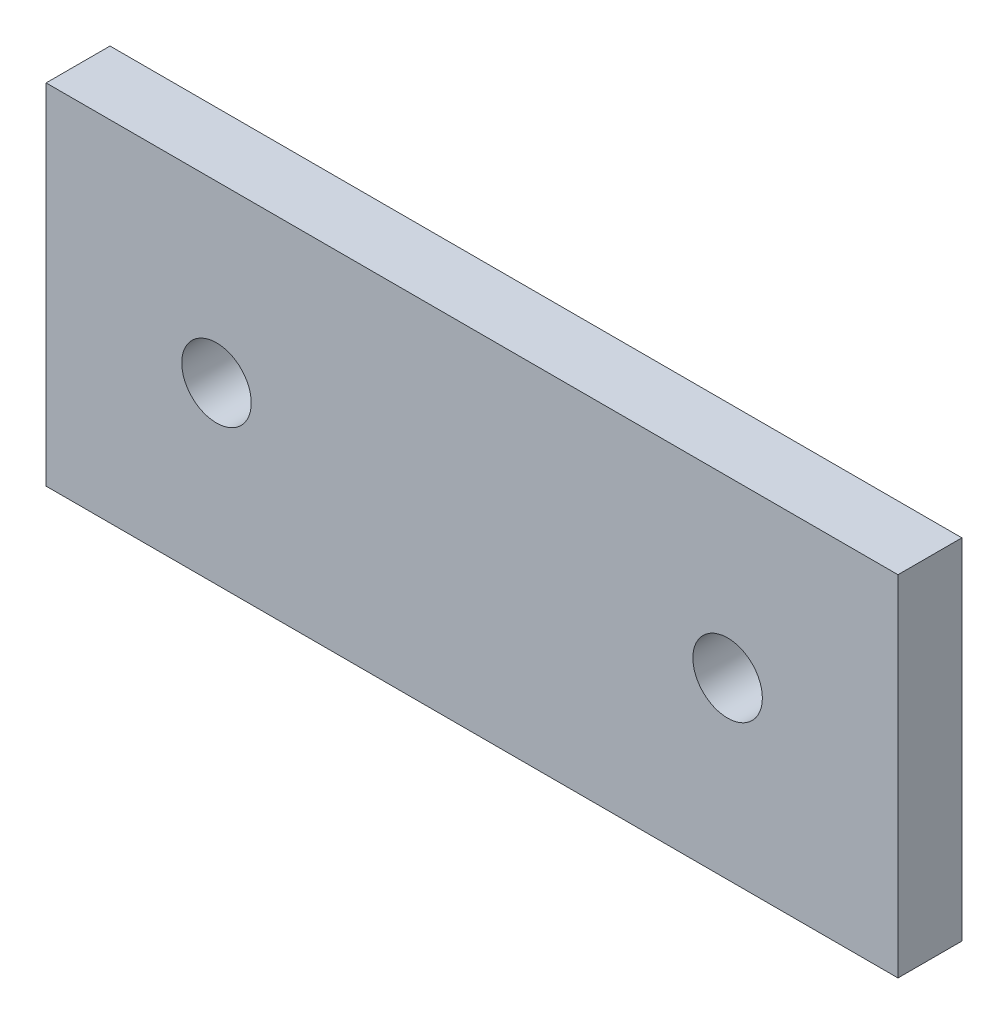
ISO-10303-21;
HEADER;
FILE_DESCRIPTION(('STEP AP214'),'2;1');
FILE_NAME('part.step','',(''),(''),'','','');
FILE_SCHEMA(('AUTOMOTIVE_DESIGN { 1 0 10303 214 1 1 1 1 }'));
ENDSEC;
DATA;
#1=APPLICATION_CONTEXT('core data for automotive mechanical design processes');
#2=APPLICATION_PROTOCOL_DEFINITION('international standard','automotive_design',2000,#1);
#3=PRODUCT_CONTEXT('',#1,'mechanical');
#4=PRODUCT('Part','Part','',(#3));
#5=PRODUCT_RELATED_PRODUCT_CATEGORY('part','',(#4));
#6=PRODUCT_DEFINITION_FORMATION('','',#4);
#7=PRODUCT_DEFINITION_CONTEXT('part definition',#1,'design');
#8=PRODUCT_DEFINITION('design','',#6,#7);
#9=PRODUCT_DEFINITION_SHAPE('','',#8);
#10=(LENGTH_UNIT() NAMED_UNIT(*) SI_UNIT(.MILLI.,.METRE.));
#11=(NAMED_UNIT(*) PLANE_ANGLE_UNIT() SI_UNIT($,.RADIAN.));
#12=(NAMED_UNIT(*) SI_UNIT($,.STERADIAN.) SOLID_ANGLE_UNIT());
#13=UNCERTAINTY_MEASURE_WITH_UNIT(LENGTH_MEASURE(1.E-05),#10,'distance_accuracy_value','');
#14=(GEOMETRIC_REPRESENTATION_CONTEXT(3) GLOBAL_UNCERTAINTY_ASSIGNED_CONTEXT((#13)) GLOBAL_UNIT_ASSIGNED_CONTEXT((#10,
#11,#12)) REPRESENTATION_CONTEXT('',''));
#15=CARTESIAN_POINT('',(0.,0.,0.));
#16=DIRECTION('',(0.,0.,1.));
#17=DIRECTION('',(1.,0.,0.));
#18=AXIS2_PLACEMENT_3D('',#15,#16,#17);
#19=CARTESIAN_POINT('',(-20.,8.2,-3.));
#20=DIRECTION('',(0.,-1.,0.));
#21=DIRECTION('',(0.,0.,-1.));
#22=AXIS2_PLACEMENT_3D('',#19,#20,#21);
#23=PLANE('',#22);
#24=DIRECTION('',(1.,0.,0.));
#25=VECTOR('',#24,1.);
#26=CARTESIAN_POINT('',(-20.,8.2,0.));
#27=LINE('',#26,#25);
#28=CARTESIAN_POINT('',(-20.,8.2,0.));
#29=VERTEX_POINT('',#28);
#30=CARTESIAN_POINT('',(20.,8.2,0.));
#31=VERTEX_POINT('',#30);
#32=EDGE_CURVE('E96',#29,#31,#27,.T.);
#33=ORIENTED_EDGE('',*,*,#32,.T.);
#34=DIRECTION('',(0.,0.,1.));
#35=VECTOR('',#34,1.);
#36=CARTESIAN_POINT('',(20.,8.2,-3.));
#37=LINE('',#36,#35);
#38=CARTESIAN_POINT('',(20.,8.2,-3.));
#39=VERTEX_POINT('',#38);
#40=EDGE_CURVE('E11',#39,#31,#37,.T.);
#41=ORIENTED_EDGE('',*,*,#40,.F.);
#42=DIRECTION('',(1.,0.,0.));
#43=VECTOR('',#42,1.);
#44=CARTESIAN_POINT('',(-20.,8.2,-3.));
#45=LINE('',#44,#43);
#46=CARTESIAN_POINT('',(-20.,8.2,-3.));
#47=VERTEX_POINT('',#46);
#48=EDGE_CURVE('E82',#47,#39,#45,.T.);
#49=ORIENTED_EDGE('',*,*,#48,.F.);
#50=DIRECTION('',(0.,0.,1.));
#51=VECTOR('',#50,1.);
#52=CARTESIAN_POINT('',(-20.,8.2,-3.));
#53=LINE('',#52,#51);
#54=EDGE_CURVE('E49',#47,#29,#53,.T.);
#55=ORIENTED_EDGE('',*,*,#54,.T.);
#56=EDGE_LOOP('',(#33,#41,#49,#55));
#57=FACE_BOUND('',#56,.T.);
#58=ADVANCED_FACE('F33',(#57),#23,.F.);
#59=CARTESIAN_POINT('',(20.,8.2,-3.));
#60=DIRECTION('',(-1.,0.,0.));
#61=DIRECTION('',(0.,-1.,0.));
#62=AXIS2_PLACEMENT_3D('',#59,#60,#61);
#63=PLANE('',#62);
#64=DIRECTION('',(0.,-1.,0.));
#65=VECTOR('',#64,1.);
#66=CARTESIAN_POINT('',(20.,8.2,0.));
#67=LINE('',#66,#65);
#68=CARTESIAN_POINT('',(20.,-8.2,0.));
#69=VERTEX_POINT('',#68);
#70=EDGE_CURVE('E87',#31,#69,#67,.T.);
#71=ORIENTED_EDGE('',*,*,#70,.T.);
#72=DIRECTION('',(0.,0.,1.));
#73=VECTOR('',#72,1.);
#74=CARTESIAN_POINT('',(20.,-8.2,-3.));
#75=LINE('',#74,#73);
#76=CARTESIAN_POINT('',(20.,-8.2,-3.));
#77=VERTEX_POINT('',#76);
#78=EDGE_CURVE('E41',#77,#69,#75,.T.);
#79=ORIENTED_EDGE('',*,*,#78,.F.);
#80=DIRECTION('',(0.,-1.,0.));
#81=VECTOR('',#80,1.);
#82=CARTESIAN_POINT('',(20.,8.2,-3.));
#83=LINE('',#82,#81);
#84=EDGE_CURVE('E74',#39,#77,#83,.T.);
#85=ORIENTED_EDGE('',*,*,#84,.F.);
#86=ORIENTED_EDGE('',*,*,#40,.T.);
#87=EDGE_LOOP('',(#71,#79,#85,#86));
#88=FACE_BOUND('',#87,.T.);
#89=ADVANCED_FACE('F86',(#88),#63,.F.);
#90=CARTESIAN_POINT('',(-20.,-8.2,-3.));
#91=DIRECTION('',(0.,-1.,0.));
#92=DIRECTION('',(0.,0.,-1.));
#93=AXIS2_PLACEMENT_3D('',#90,#91,#92);
#94=PLANE('',#93);
#95=DIRECTION('',(1.,0.,0.));
#96=VECTOR('',#95,1.);
#97=CARTESIAN_POINT('',(-20.,-8.2,0.));
#98=LINE('',#97,#96);
#99=CARTESIAN_POINT('',(-20.,-8.2,0.));
#100=VERTEX_POINT('',#99);
#101=EDGE_CURVE('E100',#100,#69,#98,.T.);
#102=ORIENTED_EDGE('',*,*,#101,.F.);
#103=DIRECTION('',(0.,0.,1.));
#104=VECTOR('',#103,1.);
#105=CARTESIAN_POINT('',(-20.,-8.2,-3.));
#106=LINE('',#105,#104);
#107=CARTESIAN_POINT('',(-20.,-8.2,-3.));
#108=VERTEX_POINT('',#107);
#109=EDGE_CURVE('E63',#108,#100,#106,.T.);
#110=ORIENTED_EDGE('',*,*,#109,.F.);
#111=DIRECTION('',(1.,0.,0.));
#112=VECTOR('',#111,1.);
#113=CARTESIAN_POINT('',(-20.,-8.2,-3.));
#114=LINE('',#113,#112);
#115=EDGE_CURVE('E81',#108,#77,#114,.T.);
#116=ORIENTED_EDGE('',*,*,#115,.T.);
#117=ORIENTED_EDGE('',*,*,#78,.T.);
#118=EDGE_LOOP('',(#102,#110,#116,#117));
#119=FACE_BOUND('',#118,.T.);
#120=ADVANCED_FACE('F90',(#119),#94,.T.);
#121=CARTESIAN_POINT('',(-20.,8.2,-3.));
#122=DIRECTION('',(-1.,0.,0.));
#123=DIRECTION('',(0.,0.,1.));
#124=AXIS2_PLACEMENT_3D('',#121,#122,#123);
#125=PLANE('',#124);
#126=DIRECTION('',(0.,-1.,0.));
#127=VECTOR('',#126,1.);
#128=CARTESIAN_POINT('',(-20.,8.2,0.));
#129=LINE('',#128,#127);
#130=EDGE_CURVE('E102',#29,#100,#129,.T.);
#131=ORIENTED_EDGE('',*,*,#130,.F.);
#132=ORIENTED_EDGE('',*,*,#54,.F.);
#133=DIRECTION('',(0.,-1.,0.));
#134=VECTOR('',#133,1.);
#135=CARTESIAN_POINT('',(-20.,8.2,-3.));
#136=LINE('',#135,#134);
#137=EDGE_CURVE('E91',#47,#108,#136,.T.);
#138=ORIENTED_EDGE('',*,*,#137,.T.);
#139=ORIENTED_EDGE('',*,*,#109,.T.);
#140=EDGE_LOOP('',(#131,#132,#138,#139));
#141=FACE_BOUND('',#140,.T.);
#142=ADVANCED_FACE('F128',(#141),#125,.T.);
#143=CARTESIAN_POINT('',(0.,0.,-3.));
#144=DIRECTION('',(0.,0.,-1.));
#145=DIRECTION('',(-1.,0.,0.));
#146=AXIS2_PLACEMENT_3D('',#143,#144,#145);
#147=PLANE('',#146);
#148=CARTESIAN_POINT('',(-12.,0.,-3.));
#149=DIRECTION('',(0.,0.,-1.));
#150=DIRECTION('',(-1.,0.,0.));
#151=AXIS2_PLACEMENT_3D('',#148,#149,#150);
#152=CIRCLE('',#151,1.63194999999999);
#153=CARTESIAN_POINT('',(-13.63195,0.,-3.));
#154=VERTEX_POINT('',#153);
#155=EDGE_CURVE('E113',#154,#154,#152,.T.);
#156=ORIENTED_EDGE('',*,*,#155,.F.);
#157=EDGE_LOOP('',(#156));
#158=FACE_BOUND('',#157,.T.);
#159=CARTESIAN_POINT('',(12.,0.,-3.));
#160=DIRECTION('',(0.,0.,-1.));
#161=DIRECTION('',(-1.,0.,0.));
#162=AXIS2_PLACEMENT_3D('',#159,#160,#161);
#163=CIRCLE('',#162,1.63194999999999);
#164=CARTESIAN_POINT('',(10.36805,0.,-3.));
#165=VERTEX_POINT('',#164);
#166=EDGE_CURVE('E98',#165,#165,#163,.T.);
#167=ORIENTED_EDGE('',*,*,#166,.F.);
#168=EDGE_LOOP('',(#167));
#169=FACE_BOUND('',#168,.T.);
#170=ORIENTED_EDGE('',*,*,#48,.T.);
#171=ORIENTED_EDGE('',*,*,#84,.T.);
#172=ORIENTED_EDGE('',*,*,#115,.F.);
#173=ORIENTED_EDGE('',*,*,#137,.F.);
#174=EDGE_LOOP('',(#170,#171,#172,#173));
#175=FACE_BOUND('',#174,.T.);
#176=ADVANCED_FACE('F78',(#158,#169,#175),#147,.T.);
#177=CARTESIAN_POINT('',(0.,0.,0.));
#178=DIRECTION('',(0.,0.,-1.));
#179=DIRECTION('',(-1.,0.,0.));
#180=AXIS2_PLACEMENT_3D('',#177,#178,#179);
#181=PLANE('',#180);
#182=CARTESIAN_POINT('',(-12.,0.,0.));
#183=DIRECTION('',(0.,0.,1.));
#184=DIRECTION('',(1.,0.,0.));
#185=AXIS2_PLACEMENT_3D('',#182,#183,#184);
#186=CIRCLE('',#185,1.63194999999999);
#187=CARTESIAN_POINT('',(-10.36805,0.,0.));
#188=VERTEX_POINT('',#187);
#189=EDGE_CURVE('E116',#188,#188,#186,.T.);
#190=ORIENTED_EDGE('',*,*,#189,.F.);
#191=EDGE_LOOP('',(#190));
#192=FACE_BOUND('',#191,.T.);
#193=CARTESIAN_POINT('',(12.,0.,0.));
#194=DIRECTION('',(0.,0.,1.));
#195=DIRECTION('',(1.,0.,0.));
#196=AXIS2_PLACEMENT_3D('',#193,#194,#195);
#197=CIRCLE('',#196,1.63194999999999);
#198=CARTESIAN_POINT('',(13.63195,0.,0.));
#199=VERTEX_POINT('',#198);
#200=EDGE_CURVE('E110',#199,#199,#197,.T.);
#201=ORIENTED_EDGE('',*,*,#200,.F.);
#202=EDGE_LOOP('',(#201));
#203=FACE_BOUND('',#202,.T.);
#204=ORIENTED_EDGE('',*,*,#32,.F.);
#205=ORIENTED_EDGE('',*,*,#130,.T.);
#206=ORIENTED_EDGE('',*,*,#101,.T.);
#207=ORIENTED_EDGE('',*,*,#70,.F.);
#208=EDGE_LOOP('',(#204,#205,#206,#207));
#209=FACE_BOUND('',#208,.T.);
#210=ADVANCED_FACE('F122',(#192,#203,#209),#181,.F.);
#211=CARTESIAN_POINT('',(12.,0.,0.));
#212=DIRECTION('',(0.,0.,1.));
#213=DIRECTION('',(1.,0.,0.));
#214=AXIS2_PLACEMENT_3D('',#211,#212,#213);
#215=CYLINDRICAL_SURFACE('',#214,1.63194999999999);
#216=ORIENTED_EDGE('',*,*,#166,.T.);
#217=EDGE_LOOP('',(#216));
#218=FACE_BOUND('',#217,.T.);
#219=ORIENTED_EDGE('',*,*,#200,.T.);
#220=EDGE_LOOP('',(#219));
#221=FACE_BOUND('',#220,.T.);
#222=ADVANCED_FACE('F125',(#218,#221),#215,.F.);
#223=CARTESIAN_POINT('',(-12.,0.,0.));
#224=DIRECTION('',(0.,0.,1.));
#225=DIRECTION('',(1.,0.,0.));
#226=AXIS2_PLACEMENT_3D('',#223,#224,#225);
#227=CYLINDRICAL_SURFACE('',#226,1.63194999999999);
#228=ORIENTED_EDGE('',*,*,#155,.T.);
#229=EDGE_LOOP('',(#228));
#230=FACE_BOUND('',#229,.T.);
#231=ORIENTED_EDGE('',*,*,#189,.T.);
#232=EDGE_LOOP('',(#231));
#233=FACE_BOUND('',#232,.T.);
#234=ADVANCED_FACE('F120',(#230,#233),#227,.F.);
#235=CLOSED_SHELL('',(#58,#89,#120,#142,#176,#210,#222,#234));
#236=MANIFOLD_SOLID_BREP('B2',#235);
#237=ADVANCED_BREP_SHAPE_REPRESENTATION('',(#18,#236),#14);
#238=SHAPE_DEFINITION_REPRESENTATION(#9,#237);
ENDSEC;
END-ISO-10303-21;
